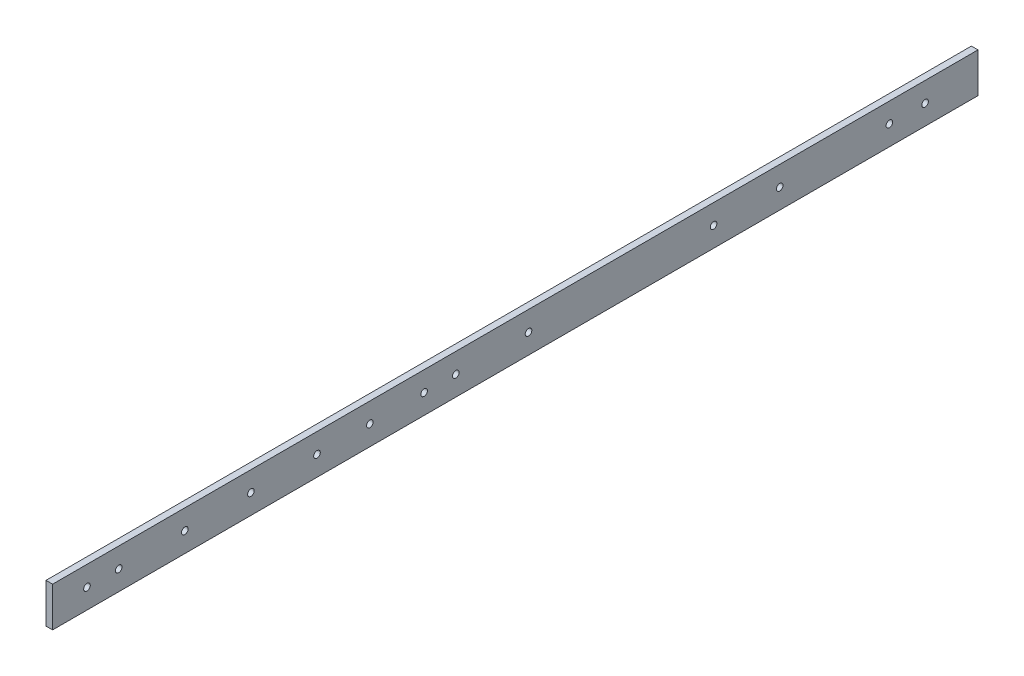
ISO-10303-21;
HEADER;
FILE_DESCRIPTION(('STEP AP214'),'2;1');
FILE_NAME('part.step','',(''),(''),'','','');
FILE_SCHEMA(('AUTOMOTIVE_DESIGN { 1 0 10303 214 1 1 1 1 }'));
ENDSEC;
DATA;
#1=APPLICATION_CONTEXT('core data for automotive mechanical design processes');
#2=APPLICATION_PROTOCOL_DEFINITION('international standard','automotive_design',2000,#1);
#3=PRODUCT_CONTEXT('',#1,'mechanical');
#4=PRODUCT('Part','Part','',(#3));
#5=PRODUCT_RELATED_PRODUCT_CATEGORY('part','',(#4));
#6=PRODUCT_DEFINITION_FORMATION('','',#4);
#7=PRODUCT_DEFINITION_CONTEXT('part definition',#1,'design');
#8=PRODUCT_DEFINITION('design','',#6,#7);
#9=PRODUCT_DEFINITION_SHAPE('','',#8);
#10=(LENGTH_UNIT() NAMED_UNIT(*) SI_UNIT(.MILLI.,.METRE.));
#11=(NAMED_UNIT(*) PLANE_ANGLE_UNIT() SI_UNIT($,.RADIAN.));
#12=(NAMED_UNIT(*) SI_UNIT($,.STERADIAN.) SOLID_ANGLE_UNIT());
#13=UNCERTAINTY_MEASURE_WITH_UNIT(LENGTH_MEASURE(1.E-05),#10,'distance_accuracy_value','');
#14=(GEOMETRIC_REPRESENTATION_CONTEXT(3) GLOBAL_UNCERTAINTY_ASSIGNED_CONTEXT((#13)) GLOBAL_UNIT_ASSIGNED_CONTEXT((#10,
#11,#12)) REPRESENTATION_CONTEXT('',''));
#15=CARTESIAN_POINT('',(0.,0.,0.));
#16=DIRECTION('',(0.,0.,1.));
#17=DIRECTION('',(1.,0.,0.));
#18=AXIS2_PLACEMENT_3D('',#15,#16,#17);
#19=CARTESIAN_POINT('',(0.,0.,700.));
#20=DIRECTION('',(1.,0.,0.));
#21=DIRECTION('',(0.,0.,-1.));
#22=AXIS2_PLACEMENT_3D('',#19,#20,#21);
#23=PLANE('',#22);
#24=CARTESIAN_POINT('',(0.,15.,674.));
#25=DIRECTION('',(1.,0.,0.));
#26=DIRECTION('',(0.,0.,-1.));
#27=AXIS2_PLACEMENT_3D('',#24,#25,#26);
#28=CIRCLE('',#27,2.49999999999991);
#29=CARTESIAN_POINT('',(0.,15.,671.5));
#30=VERTEX_POINT('',#29);
#31=EDGE_CURVE('E106',#30,#30,#28,.T.);
#32=ORIENTED_EDGE('',*,*,#31,.T.);
#33=EDGE_LOOP('',(#32));
#34=FACE_BOUND('',#33,.T.);
#35=CARTESIAN_POINT('',(0.,15.,650.));
#36=DIRECTION('',(1.,0.,0.));
#37=DIRECTION('',(0.,0.,-1.));
#38=AXIS2_PLACEMENT_3D('',#35,#36,#37);
#39=CIRCLE('',#38,2.49999999999991);
#40=CARTESIAN_POINT('',(0.,15.,647.5));
#41=VERTEX_POINT('',#40);
#42=EDGE_CURVE('E183',#41,#41,#39,.T.);
#43=ORIENTED_EDGE('',*,*,#42,.T.);
#44=EDGE_LOOP('',(#43));
#45=FACE_BOUND('',#44,.T.);
#46=CARTESIAN_POINT('',(0.,15.,600.));
#47=DIRECTION('',(1.,0.,0.));
#48=DIRECTION('',(0.,0.,-1.));
#49=AXIS2_PLACEMENT_3D('',#46,#47,#48);
#50=CIRCLE('',#49,2.49999999999991);
#51=CARTESIAN_POINT('',(0.,15.,597.5));
#52=VERTEX_POINT('',#51);
#53=EDGE_CURVE('E177',#52,#52,#50,.T.);
#54=ORIENTED_EDGE('',*,*,#53,.T.);
#55=EDGE_LOOP('',(#54));
#56=FACE_BOUND('',#55,.T.);
#57=CARTESIAN_POINT('',(0.,15.,550.));
#58=DIRECTION('',(1.,0.,0.));
#59=DIRECTION('',(0.,0.,-1.));
#60=AXIS2_PLACEMENT_3D('',#57,#58,#59);
#61=CIRCLE('',#60,2.49999999999991);
#62=CARTESIAN_POINT('',(0.,15.,547.5));
#63=VERTEX_POINT('',#62);
#64=EDGE_CURVE('E171',#63,#63,#61,.T.);
#65=ORIENTED_EDGE('',*,*,#64,.T.);
#66=EDGE_LOOP('',(#65));
#67=FACE_BOUND('',#66,.T.);
#68=CARTESIAN_POINT('',(0.,15.,500.));
#69=DIRECTION('',(1.,0.,0.));
#70=DIRECTION('',(0.,0.,-1.));
#71=AXIS2_PLACEMENT_3D('',#68,#69,#70);
#72=CIRCLE('',#71,2.50000000000002);
#73=CARTESIAN_POINT('',(0.,15.,497.5));
#74=VERTEX_POINT('',#73);
#75=EDGE_CURVE('E165',#74,#74,#72,.T.);
#76=ORIENTED_EDGE('',*,*,#75,.T.);
#77=EDGE_LOOP('',(#76));
#78=FACE_BOUND('',#77,.T.);
#79=CARTESIAN_POINT('',(0.,15.,460.));
#80=DIRECTION('',(1.,0.,0.));
#81=DIRECTION('',(0.,0.,-1.));
#82=AXIS2_PLACEMENT_3D('',#79,#80,#81);
#83=CIRCLE('',#82,2.50000000000002);
#84=CARTESIAN_POINT('',(0.,15.,457.5));
#85=VERTEX_POINT('',#84);
#86=EDGE_CURVE('E159',#85,#85,#83,.T.);
#87=ORIENTED_EDGE('',*,*,#86,.T.);
#88=EDGE_LOOP('',(#87));
#89=FACE_BOUND('',#88,.T.);
#90=CARTESIAN_POINT('',(0.,15.,419.));
#91=DIRECTION('',(1.,0.,0.));
#92=DIRECTION('',(0.,0.,-1.));
#93=AXIS2_PLACEMENT_3D('',#90,#91,#92);
#94=CIRCLE('',#93,2.50000000000002);
#95=CARTESIAN_POINT('',(0.,15.,416.5));
#96=VERTEX_POINT('',#95);
#97=EDGE_CURVE('E153',#96,#96,#94,.T.);
#98=ORIENTED_EDGE('',*,*,#97,.T.);
#99=EDGE_LOOP('',(#98));
#100=FACE_BOUND('',#99,.T.);
#101=CARTESIAN_POINT('',(0.,15.,395.));
#102=DIRECTION('',(1.,0.,0.));
#103=DIRECTION('',(0.,0.,-1.));
#104=AXIS2_PLACEMENT_3D('',#101,#102,#103);
#105=CIRCLE('',#104,2.50000000000002);
#106=CARTESIAN_POINT('',(0.,15.,392.5));
#107=VERTEX_POINT('',#106);
#108=EDGE_CURVE('E147',#107,#107,#105,.T.);
#109=ORIENTED_EDGE('',*,*,#108,.T.);
#110=EDGE_LOOP('',(#109));
#111=FACE_BOUND('',#110,.T.);
#112=CARTESIAN_POINT('',(0.,15.,340.));
#113=DIRECTION('',(1.,0.,0.));
#114=DIRECTION('',(0.,0.,-1.));
#115=AXIS2_PLACEMENT_3D('',#112,#113,#114);
#116=CIRCLE('',#115,2.50000000000002);
#117=CARTESIAN_POINT('',(0.,15.,337.5));
#118=VERTEX_POINT('',#117);
#119=EDGE_CURVE('E130',#118,#118,#116,.T.);
#120=ORIENTED_EDGE('',*,*,#119,.T.);
#121=EDGE_LOOP('',(#120));
#122=FACE_BOUND('',#121,.T.);
#123=CARTESIAN_POINT('',(0.,15.,66.9999999999999));
#124=DIRECTION('',(1.,0.,0.));
#125=DIRECTION('',(0.,0.,-1.));
#126=AXIS2_PLACEMENT_3D('',#123,#124,#125);
#127=CIRCLE('',#126,2.5);
#128=CARTESIAN_POINT('',(0.,15.,64.4999999999999));
#129=VERTEX_POINT('',#128);
#130=EDGE_CURVE('E131',#129,#129,#127,.T.);
#131=ORIENTED_EDGE('',*,*,#130,.T.);
#132=EDGE_LOOP('',(#131));
#133=FACE_BOUND('',#132,.T.);
#134=CARTESIAN_POINT('',(0.,15.,200.));
#135=DIRECTION('',(1.,0.,0.));
#136=DIRECTION('',(0.,0.,-1.));
#137=AXIS2_PLACEMENT_3D('',#134,#135,#136);
#138=CIRCLE('',#137,2.5);
#139=CARTESIAN_POINT('',(0.,15.,197.5));
#140=VERTEX_POINT('',#139);
#141=EDGE_CURVE('E137',#140,#140,#138,.T.);
#142=ORIENTED_EDGE('',*,*,#141,.T.);
#143=EDGE_LOOP('',(#142));
#144=FACE_BOUND('',#143,.T.);
#145=CARTESIAN_POINT('',(0.,15.,150.));
#146=DIRECTION('',(1.,0.,0.));
#147=DIRECTION('',(0.,0.,-1.));
#148=AXIS2_PLACEMENT_3D('',#145,#146,#147);
#149=CIRCLE('',#148,2.5);
#150=CARTESIAN_POINT('',(0.,15.,147.5));
#151=VERTEX_POINT('',#150);
#152=EDGE_CURVE('E117',#151,#151,#149,.T.);
#153=ORIENTED_EDGE('',*,*,#152,.T.);
#154=EDGE_LOOP('',(#153));
#155=FACE_BOUND('',#154,.T.);
#156=CARTESIAN_POINT('',(0.,15.,39.9999999999999));
#157=DIRECTION('',(1.,0.,0.));
#158=DIRECTION('',(0.,0.,-1.));
#159=AXIS2_PLACEMENT_3D('',#156,#157,#158);
#160=CIRCLE('',#159,2.5);
#161=CARTESIAN_POINT('',(0.,15.,37.4999999999999));
#162=VERTEX_POINT('',#161);
#163=EDGE_CURVE('E124',#162,#162,#160,.T.);
#164=ORIENTED_EDGE('',*,*,#163,.T.);
#165=EDGE_LOOP('',(#164));
#166=FACE_BOUND('',#165,.T.);
#167=DIRECTION('',(0.,-1.,0.));
#168=VECTOR('',#167,1.);
#169=CARTESIAN_POINT('',(0.,0.,0.));
#170=LINE('',#169,#168);
#171=CARTESIAN_POINT('',(0.,30.,0.));
#172=VERTEX_POINT('',#171);
#173=CARTESIAN_POINT('',(0.,0.,0.));
#174=VERTEX_POINT('',#173);
#175=EDGE_CURVE('E103',#172,#174,#170,.T.);
#176=ORIENTED_EDGE('',*,*,#175,.T.);
#177=DIRECTION('',(0.,0.,-1.));
#178=VECTOR('',#177,1.);
#179=CARTESIAN_POINT('',(0.,0.,700.));
#180=LINE('',#179,#178);
#181=CARTESIAN_POINT('',(0.,0.,700.));
#182=VERTEX_POINT('',#181);
#183=EDGE_CURVE('E11',#182,#174,#180,.T.);
#184=ORIENTED_EDGE('',*,*,#183,.F.);
#185=DIRECTION('',(0.,-1.,0.));
#186=VECTOR('',#185,1.);
#187=CARTESIAN_POINT('',(0.,0.,700.));
#188=LINE('',#187,#186);
#189=CARTESIAN_POINT('',(0.,30.,700.));
#190=VERTEX_POINT('',#189);
#191=EDGE_CURVE('E91',#190,#182,#188,.T.);
#192=ORIENTED_EDGE('',*,*,#191,.F.);
#193=DIRECTION('',(0.,0.,-1.));
#194=VECTOR('',#193,1.);
#195=CARTESIAN_POINT('',(0.,30.,700.));
#196=LINE('',#195,#194);
#197=EDGE_CURVE('E99',#190,#172,#196,.T.);
#198=ORIENTED_EDGE('',*,*,#197,.T.);
#199=EDGE_LOOP('',(#176,#184,#192,#198));
#200=FACE_BOUND('',#199,.T.);
#201=ADVANCED_FACE('F40',(#34,#45,#56,#67,#78,#89,#100,#111,#122,#133,#144,#155,#166,#200),#23,.F.);
#202=CARTESIAN_POINT('',(0.,0.,700.));
#203=DIRECTION('',(0.,1.,0.));
#204=DIRECTION('',(0.,0.,1.));
#205=AXIS2_PLACEMENT_3D('',#202,#203,#204);
#206=PLANE('',#205);
#207=DIRECTION('',(1.,0.,0.));
#208=VECTOR('',#207,1.);
#209=CARTESIAN_POINT('',(0.,0.,0.));
#210=LINE('',#209,#208);
#211=CARTESIAN_POINT('',(5.,0.,0.));
#212=VERTEX_POINT('',#211);
#213=EDGE_CURVE('E95',#174,#212,#210,.T.);
#214=ORIENTED_EDGE('',*,*,#213,.T.);
#215=DIRECTION('',(0.,0.,-1.));
#216=VECTOR('',#215,1.);
#217=CARTESIAN_POINT('',(5.,0.,700.));
#218=LINE('',#217,#216);
#219=CARTESIAN_POINT('',(5.,0.,700.));
#220=VERTEX_POINT('',#219);
#221=EDGE_CURVE('E48',#220,#212,#218,.T.);
#222=ORIENTED_EDGE('',*,*,#221,.F.);
#223=DIRECTION('',(1.,0.,0.));
#224=VECTOR('',#223,1.);
#225=CARTESIAN_POINT('',(0.,0.,700.));
#226=LINE('',#225,#224);
#227=EDGE_CURVE('E86',#182,#220,#226,.T.);
#228=ORIENTED_EDGE('',*,*,#227,.F.);
#229=ORIENTED_EDGE('',*,*,#183,.T.);
#230=EDGE_LOOP('',(#214,#222,#228,#229));
#231=FACE_BOUND('',#230,.T.);
#232=ADVANCED_FACE('F94',(#231),#206,.F.);
#233=CARTESIAN_POINT('',(5.,0.,700.));
#234=DIRECTION('',(-1.,0.,0.));
#235=DIRECTION('',(0.,0.,1.));
#236=AXIS2_PLACEMENT_3D('',#233,#234,#235);
#237=PLANE('',#236);
#238=CARTESIAN_POINT('',(5.,15.,674.));
#239=DIRECTION('',(1.,0.,0.));
#240=DIRECTION('',(0.,0.,-1.));
#241=AXIS2_PLACEMENT_3D('',#238,#239,#240);
#242=CIRCLE('',#241,2.49999999999991);
#243=CARTESIAN_POINT('',(5.,15.,671.5));
#244=VERTEX_POINT('',#243);
#245=EDGE_CURVE('E189',#244,#244,#242,.T.);
#246=ORIENTED_EDGE('',*,*,#245,.F.);
#247=EDGE_LOOP('',(#246));
#248=FACE_BOUND('',#247,.T.);
#249=CARTESIAN_POINT('',(5.,15.,650.));
#250=DIRECTION('',(1.,0.,0.));
#251=DIRECTION('',(0.,0.,-1.));
#252=AXIS2_PLACEMENT_3D('',#249,#250,#251);
#253=CIRCLE('',#252,2.49999999999991);
#254=CARTESIAN_POINT('',(5.,15.,647.5));
#255=VERTEX_POINT('',#254);
#256=EDGE_CURVE('E186',#255,#255,#253,.T.);
#257=ORIENTED_EDGE('',*,*,#256,.F.);
#258=EDGE_LOOP('',(#257));
#259=FACE_BOUND('',#258,.T.);
#260=CARTESIAN_POINT('',(5.,15.,600.));
#261=DIRECTION('',(1.,0.,0.));
#262=DIRECTION('',(0.,0.,-1.));
#263=AXIS2_PLACEMENT_3D('',#260,#261,#262);
#264=CIRCLE('',#263,2.49999999999991);
#265=CARTESIAN_POINT('',(5.,15.,597.5));
#266=VERTEX_POINT('',#265);
#267=EDGE_CURVE('E180',#266,#266,#264,.T.);
#268=ORIENTED_EDGE('',*,*,#267,.F.);
#269=EDGE_LOOP('',(#268));
#270=FACE_BOUND('',#269,.T.);
#271=CARTESIAN_POINT('',(5.,15.,550.));
#272=DIRECTION('',(1.,0.,0.));
#273=DIRECTION('',(0.,0.,-1.));
#274=AXIS2_PLACEMENT_3D('',#271,#272,#273);
#275=CIRCLE('',#274,2.49999999999991);
#276=CARTESIAN_POINT('',(5.,15.,547.5));
#277=VERTEX_POINT('',#276);
#278=EDGE_CURVE('E174',#277,#277,#275,.T.);
#279=ORIENTED_EDGE('',*,*,#278,.F.);
#280=EDGE_LOOP('',(#279));
#281=FACE_BOUND('',#280,.T.);
#282=CARTESIAN_POINT('',(5.,15.,500.));
#283=DIRECTION('',(1.,0.,0.));
#284=DIRECTION('',(0.,0.,-1.));
#285=AXIS2_PLACEMENT_3D('',#282,#283,#284);
#286=CIRCLE('',#285,2.50000000000002);
#287=CARTESIAN_POINT('',(5.,15.,497.5));
#288=VERTEX_POINT('',#287);
#289=EDGE_CURVE('E168',#288,#288,#286,.T.);
#290=ORIENTED_EDGE('',*,*,#289,.F.);
#291=EDGE_LOOP('',(#290));
#292=FACE_BOUND('',#291,.T.);
#293=CARTESIAN_POINT('',(5.,15.,460.));
#294=DIRECTION('',(1.,0.,0.));
#295=DIRECTION('',(0.,0.,-1.));
#296=AXIS2_PLACEMENT_3D('',#293,#294,#295);
#297=CIRCLE('',#296,2.50000000000002);
#298=CARTESIAN_POINT('',(5.,15.,457.5));
#299=VERTEX_POINT('',#298);
#300=EDGE_CURVE('E162',#299,#299,#297,.T.);
#301=ORIENTED_EDGE('',*,*,#300,.F.);
#302=EDGE_LOOP('',(#301));
#303=FACE_BOUND('',#302,.T.);
#304=CARTESIAN_POINT('',(5.,15.,419.));
#305=DIRECTION('',(1.,0.,0.));
#306=DIRECTION('',(0.,0.,-1.));
#307=AXIS2_PLACEMENT_3D('',#304,#305,#306);
#308=CIRCLE('',#307,2.50000000000002);
#309=CARTESIAN_POINT('',(5.,15.,416.5));
#310=VERTEX_POINT('',#309);
#311=EDGE_CURVE('E156',#310,#310,#308,.T.);
#312=ORIENTED_EDGE('',*,*,#311,.F.);
#313=EDGE_LOOP('',(#312));
#314=FACE_BOUND('',#313,.T.);
#315=CARTESIAN_POINT('',(5.,15.,395.));
#316=DIRECTION('',(1.,0.,0.));
#317=DIRECTION('',(0.,0.,-1.));
#318=AXIS2_PLACEMENT_3D('',#315,#316,#317);
#319=CIRCLE('',#318,2.50000000000002);
#320=CARTESIAN_POINT('',(5.,15.,392.5));
#321=VERTEX_POINT('',#320);
#322=EDGE_CURVE('E150',#321,#321,#319,.T.);
#323=ORIENTED_EDGE('',*,*,#322,.F.);
#324=EDGE_LOOP('',(#323));
#325=FACE_BOUND('',#324,.T.);
#326=CARTESIAN_POINT('',(5.,15.,340.));
#327=DIRECTION('',(1.,0.,0.));
#328=DIRECTION('',(0.,0.,-1.));
#329=AXIS2_PLACEMENT_3D('',#326,#327,#328);
#330=CIRCLE('',#329,2.50000000000002);
#331=CARTESIAN_POINT('',(5.,15.,337.5));
#332=VERTEX_POINT('',#331);
#333=EDGE_CURVE('E144',#332,#332,#330,.T.);
#334=ORIENTED_EDGE('',*,*,#333,.F.);
#335=EDGE_LOOP('',(#334));
#336=FACE_BOUND('',#335,.T.);
#337=CARTESIAN_POINT('',(5.,15.,66.9999999999999));
#338=DIRECTION('',(1.,0.,0.));
#339=DIRECTION('',(0.,0.,-1.));
#340=AXIS2_PLACEMENT_3D('',#337,#338,#339);
#341=CIRCLE('',#340,2.5);
#342=CARTESIAN_POINT('',(5.,15.,64.4999999999999));
#343=VERTEX_POINT('',#342);
#344=EDGE_CURVE('E134',#343,#343,#341,.T.);
#345=ORIENTED_EDGE('',*,*,#344,.F.);
#346=EDGE_LOOP('',(#345));
#347=FACE_BOUND('',#346,.T.);
#348=CARTESIAN_POINT('',(5.,15.,200.));
#349=DIRECTION('',(1.,0.,0.));
#350=DIRECTION('',(0.,0.,-1.));
#351=AXIS2_PLACEMENT_3D('',#348,#349,#350);
#352=CIRCLE('',#351,2.5);
#353=CARTESIAN_POINT('',(5.,15.,197.5));
#354=VERTEX_POINT('',#353);
#355=EDGE_CURVE('E121',#354,#354,#352,.T.);
#356=ORIENTED_EDGE('',*,*,#355,.F.);
#357=EDGE_LOOP('',(#356));
#358=FACE_BOUND('',#357,.T.);
#359=CARTESIAN_POINT('',(5.,15.,150.));
#360=DIRECTION('',(1.,0.,0.));
#361=DIRECTION('',(0.,0.,-1.));
#362=AXIS2_PLACEMENT_3D('',#359,#360,#361);
#363=CIRCLE('',#362,2.5);
#364=CARTESIAN_POINT('',(5.,15.,147.5));
#365=VERTEX_POINT('',#364);
#366=EDGE_CURVE('E120',#365,#365,#363,.T.);
#367=ORIENTED_EDGE('',*,*,#366,.F.);
#368=EDGE_LOOP('',(#367));
#369=FACE_BOUND('',#368,.T.);
#370=CARTESIAN_POINT('',(5.,15.,39.9999999999999));
#371=DIRECTION('',(1.,0.,0.));
#372=DIRECTION('',(0.,0.,-1.));
#373=AXIS2_PLACEMENT_3D('',#370,#371,#372);
#374=CIRCLE('',#373,2.5);
#375=CARTESIAN_POINT('',(5.,15.,37.4999999999999));
#376=VERTEX_POINT('',#375);
#377=EDGE_CURVE('E127',#376,#376,#374,.T.);
#378=ORIENTED_EDGE('',*,*,#377,.F.);
#379=EDGE_LOOP('',(#378));
#380=FACE_BOUND('',#379,.T.);
#381=DIRECTION('',(0.,1.,0.));
#382=VECTOR('',#381,1.);
#383=CARTESIAN_POINT('',(5.,0.,0.));
#384=LINE('',#383,#382);
#385=CARTESIAN_POINT('',(5.,30.,0.));
#386=VERTEX_POINT('',#385);
#387=EDGE_CURVE('E73',#212,#386,#384,.T.);
#388=ORIENTED_EDGE('',*,*,#387,.T.);
#389=DIRECTION('',(0.,0.,-1.));
#390=VECTOR('',#389,1.);
#391=CARTESIAN_POINT('',(5.,30.,700.));
#392=LINE('',#391,#390);
#393=CARTESIAN_POINT('',(5.,30.,700.));
#394=VERTEX_POINT('',#393);
#395=EDGE_CURVE('E96',#394,#386,#392,.T.);
#396=ORIENTED_EDGE('',*,*,#395,.F.);
#397=DIRECTION('',(0.,1.,0.));
#398=VECTOR('',#397,1.);
#399=CARTESIAN_POINT('',(5.,0.,700.));
#400=LINE('',#399,#398);
#401=EDGE_CURVE('E89',#220,#394,#400,.T.);
#402=ORIENTED_EDGE('',*,*,#401,.F.);
#403=ORIENTED_EDGE('',*,*,#221,.T.);
#404=EDGE_LOOP('',(#388,#396,#402,#403));
#405=FACE_BOUND('',#404,.T.);
#406=ADVANCED_FACE('F97',(#248,#259,#270,#281,#292,#303,#314,#325,#336,#347,#358,#369,#380,
#405),#237,.F.);
#407=CARTESIAN_POINT('',(0.,30.,700.));
#408=DIRECTION('',(0.,-1.,0.));
#409=DIRECTION('',(0.,0.,-1.));
#410=AXIS2_PLACEMENT_3D('',#407,#408,#409);
#411=PLANE('',#410);
#412=DIRECTION('',(-1.,0.,0.));
#413=VECTOR('',#412,1.);
#414=CARTESIAN_POINT('',(0.,30.,0.));
#415=LINE('',#414,#413);
#416=EDGE_CURVE('E79',#386,#172,#415,.T.);
#417=ORIENTED_EDGE('',*,*,#416,.T.);
#418=ORIENTED_EDGE('',*,*,#197,.F.);
#419=DIRECTION('',(-1.,0.,0.));
#420=VECTOR('',#419,1.);
#421=CARTESIAN_POINT('',(0.,30.,700.));
#422=LINE('',#421,#420);
#423=EDGE_CURVE('E56',#394,#190,#422,.T.);
#424=ORIENTED_EDGE('',*,*,#423,.F.);
#425=ORIENTED_EDGE('',*,*,#395,.T.);
#426=EDGE_LOOP('',(#417,#418,#424,#425));
#427=FACE_BOUND('',#426,.T.);
#428=ADVANCED_FACE('F111',(#427),#411,.F.);
#429=CARTESIAN_POINT('',(0.,0.,700.));
#430=DIRECTION('',(0.,0.,-1.));
#431=DIRECTION('',(-1.,0.,0.));
#432=AXIS2_PLACEMENT_3D('',#429,#430,#431);
#433=PLANE('',#432);
#434=ORIENTED_EDGE('',*,*,#191,.T.);
#435=ORIENTED_EDGE('',*,*,#227,.T.);
#436=ORIENTED_EDGE('',*,*,#401,.T.);
#437=ORIENTED_EDGE('',*,*,#423,.T.);
#438=EDGE_LOOP('',(#434,#435,#436,#437));
#439=FACE_BOUND('',#438,.T.);
#440=ADVANCED_FACE('F87',(#439),#433,.F.);
#441=CARTESIAN_POINT('',(0.,0.,0.));
#442=DIRECTION('',(0.,0.,-1.));
#443=DIRECTION('',(-1.,0.,0.));
#444=AXIS2_PLACEMENT_3D('',#441,#442,#443);
#445=PLANE('',#444);
#446=ORIENTED_EDGE('',*,*,#175,.F.);
#447=ORIENTED_EDGE('',*,*,#416,.F.);
#448=ORIENTED_EDGE('',*,*,#387,.F.);
#449=ORIENTED_EDGE('',*,*,#213,.F.);
#450=EDGE_LOOP('',(#446,#447,#448,#449));
#451=FACE_BOUND('',#450,.T.);
#452=ADVANCED_FACE('F114',(#451),#445,.T.);
#453=CARTESIAN_POINT('',(0.,15.,39.9999999999999));
#454=DIRECTION('',(1.,0.,0.));
#455=DIRECTION('',(0.,0.,-1.));
#456=AXIS2_PLACEMENT_3D('',#453,#454,#455);
#457=CYLINDRICAL_SURFACE('',#456,2.5);
#458=ORIENTED_EDGE('',*,*,#163,.F.);
#459=EDGE_LOOP('',(#458));
#460=FACE_BOUND('',#459,.T.);
#461=ORIENTED_EDGE('',*,*,#377,.T.);
#462=EDGE_LOOP('',(#461));
#463=FACE_BOUND('',#462,.T.);
#464=ADVANCED_FACE('F231',(#460,#463),#457,.F.);
#465=CARTESIAN_POINT('',(0.,15.,150.));
#466=DIRECTION('',(1.,0.,0.));
#467=DIRECTION('',(0.,0.,-1.));
#468=AXIS2_PLACEMENT_3D('',#465,#466,#467);
#469=CYLINDRICAL_SURFACE('',#468,2.5);
#470=ORIENTED_EDGE('',*,*,#152,.F.);
#471=EDGE_LOOP('',(#470));
#472=FACE_BOUND('',#471,.T.);
#473=ORIENTED_EDGE('',*,*,#366,.T.);
#474=EDGE_LOOP('',(#473));
#475=FACE_BOUND('',#474,.T.);
#476=ADVANCED_FACE('F233',(#472,#475),#469,.F.);
#477=CARTESIAN_POINT('',(0.,15.,200.));
#478=DIRECTION('',(1.,0.,0.));
#479=DIRECTION('',(0.,0.,-1.));
#480=AXIS2_PLACEMENT_3D('',#477,#478,#479);
#481=CYLINDRICAL_SURFACE('',#480,2.5);
#482=ORIENTED_EDGE('',*,*,#141,.F.);
#483=EDGE_LOOP('',(#482));
#484=FACE_BOUND('',#483,.T.);
#485=ORIENTED_EDGE('',*,*,#355,.T.);
#486=EDGE_LOOP('',(#485));
#487=FACE_BOUND('',#486,.T.);
#488=ADVANCED_FACE('F240',(#484,#487),#481,.F.);
#489=CARTESIAN_POINT('',(0.,15.,66.9999999999999));
#490=DIRECTION('',(1.,0.,0.));
#491=DIRECTION('',(0.,0.,-1.));
#492=AXIS2_PLACEMENT_3D('',#489,#490,#491);
#493=CYLINDRICAL_SURFACE('',#492,2.5);
#494=ORIENTED_EDGE('',*,*,#130,.F.);
#495=EDGE_LOOP('',(#494));
#496=FACE_BOUND('',#495,.T.);
#497=ORIENTED_EDGE('',*,*,#344,.T.);
#498=EDGE_LOOP('',(#497));
#499=FACE_BOUND('',#498,.T.);
#500=ADVANCED_FACE('F295',(#496,#499),#493,.F.);
#501=CARTESIAN_POINT('',(0.,15.,340.));
#502=DIRECTION('',(1.,0.,0.));
#503=DIRECTION('',(0.,0.,-1.));
#504=AXIS2_PLACEMENT_3D('',#501,#502,#503);
#505=CYLINDRICAL_SURFACE('',#504,2.50000000000002);
#506=ORIENTED_EDGE('',*,*,#119,.F.);
#507=EDGE_LOOP('',(#506));
#508=FACE_BOUND('',#507,.T.);
#509=ORIENTED_EDGE('',*,*,#333,.T.);
#510=EDGE_LOOP('',(#509));
#511=FACE_BOUND('',#510,.T.);
#512=ADVANCED_FACE('F305',(#508,#511),#505,.F.);
#513=CARTESIAN_POINT('',(0.,15.,395.));
#514=DIRECTION('',(1.,0.,0.));
#515=DIRECTION('',(0.,0.,-1.));
#516=AXIS2_PLACEMENT_3D('',#513,#514,#515);
#517=CYLINDRICAL_SURFACE('',#516,2.50000000000002);
#518=ORIENTED_EDGE('',*,*,#108,.F.);
#519=EDGE_LOOP('',(#518));
#520=FACE_BOUND('',#519,.T.);
#521=ORIENTED_EDGE('',*,*,#322,.T.);
#522=EDGE_LOOP('',(#521));
#523=FACE_BOUND('',#522,.T.);
#524=ADVANCED_FACE('F314',(#520,#523),#517,.F.);
#525=CARTESIAN_POINT('',(0.,15.,419.));
#526=DIRECTION('',(1.,0.,0.));
#527=DIRECTION('',(0.,0.,-1.));
#528=AXIS2_PLACEMENT_3D('',#525,#526,#527);
#529=CYLINDRICAL_SURFACE('',#528,2.50000000000002);
#530=ORIENTED_EDGE('',*,*,#97,.F.);
#531=EDGE_LOOP('',(#530));
#532=FACE_BOUND('',#531,.T.);
#533=ORIENTED_EDGE('',*,*,#311,.T.);
#534=EDGE_LOOP('',(#533));
#535=FACE_BOUND('',#534,.T.);
#536=ADVANCED_FACE('F324',(#532,#535),#529,.F.);
#537=CARTESIAN_POINT('',(0.,15.,460.));
#538=DIRECTION('',(1.,0.,0.));
#539=DIRECTION('',(0.,0.,-1.));
#540=AXIS2_PLACEMENT_3D('',#537,#538,#539);
#541=CYLINDRICAL_SURFACE('',#540,2.50000000000002);
#542=ORIENTED_EDGE('',*,*,#86,.F.);
#543=EDGE_LOOP('',(#542));
#544=FACE_BOUND('',#543,.T.);
#545=ORIENTED_EDGE('',*,*,#300,.T.);
#546=EDGE_LOOP('',(#545));
#547=FACE_BOUND('',#546,.T.);
#548=ADVANCED_FACE('F334',(#544,#547),#541,.F.);
#549=CARTESIAN_POINT('',(0.,15.,500.));
#550=DIRECTION('',(1.,0.,0.));
#551=DIRECTION('',(0.,0.,-1.));
#552=AXIS2_PLACEMENT_3D('',#549,#550,#551);
#553=CYLINDRICAL_SURFACE('',#552,2.50000000000002);
#554=ORIENTED_EDGE('',*,*,#75,.F.);
#555=EDGE_LOOP('',(#554));
#556=FACE_BOUND('',#555,.T.);
#557=ORIENTED_EDGE('',*,*,#289,.T.);
#558=EDGE_LOOP('',(#557));
#559=FACE_BOUND('',#558,.T.);
#560=ADVANCED_FACE('F344',(#556,#559),#553,.F.);
#561=CARTESIAN_POINT('',(0.,15.,550.));
#562=DIRECTION('',(1.,0.,0.));
#563=DIRECTION('',(0.,0.,-1.));
#564=AXIS2_PLACEMENT_3D('',#561,#562,#563);
#565=CYLINDRICAL_SURFACE('',#564,2.49999999999991);
#566=ORIENTED_EDGE('',*,*,#64,.F.);
#567=EDGE_LOOP('',(#566));
#568=FACE_BOUND('',#567,.T.);
#569=ORIENTED_EDGE('',*,*,#278,.T.);
#570=EDGE_LOOP('',(#569));
#571=FACE_BOUND('',#570,.T.);
#572=ADVANCED_FACE('F354',(#568,#571),#565,.F.);
#573=CARTESIAN_POINT('',(0.,15.,600.));
#574=DIRECTION('',(1.,0.,0.));
#575=DIRECTION('',(0.,0.,-1.));
#576=AXIS2_PLACEMENT_3D('',#573,#574,#575);
#577=CYLINDRICAL_SURFACE('',#576,2.49999999999991);
#578=ORIENTED_EDGE('',*,*,#53,.F.);
#579=EDGE_LOOP('',(#578));
#580=FACE_BOUND('',#579,.T.);
#581=ORIENTED_EDGE('',*,*,#267,.T.);
#582=EDGE_LOOP('',(#581));
#583=FACE_BOUND('',#582,.T.);
#584=ADVANCED_FACE('F364',(#580,#583),#577,.F.);
#585=CARTESIAN_POINT('',(0.,15.,650.));
#586=DIRECTION('',(1.,0.,0.));
#587=DIRECTION('',(0.,0.,-1.));
#588=AXIS2_PLACEMENT_3D('',#585,#586,#587);
#589=CYLINDRICAL_SURFACE('',#588,2.49999999999991);
#590=ORIENTED_EDGE('',*,*,#42,.F.);
#591=EDGE_LOOP('',(#590));
#592=FACE_BOUND('',#591,.T.);
#593=ORIENTED_EDGE('',*,*,#256,.T.);
#594=EDGE_LOOP('',(#593));
#595=FACE_BOUND('',#594,.T.);
#596=ADVANCED_FACE('F200',(#592,#595),#589,.F.);
#597=CARTESIAN_POINT('',(0.,15.,674.));
#598=DIRECTION('',(1.,0.,0.));
#599=DIRECTION('',(0.,0.,-1.));
#600=AXIS2_PLACEMENT_3D('',#597,#598,#599);
#601=CYLINDRICAL_SURFACE('',#600,2.49999999999991);
#602=ORIENTED_EDGE('',*,*,#31,.F.);
#603=EDGE_LOOP('',(#602));
#604=FACE_BOUND('',#603,.T.);
#605=ORIENTED_EDGE('',*,*,#245,.T.);
#606=EDGE_LOOP('',(#605));
#607=FACE_BOUND('',#606,.T.);
#608=ADVANCED_FACE('F197',(#604,#607),#601,.F.);
#609=CLOSED_SHELL('',(#201,#232,#406,#428,#440,#452,#464,#476,#488,#500,#512,#524,#536,#548,
#560,#572,#584,#596,#608));
#610=MANIFOLD_SOLID_BREP('B2',#609);
#611=ADVANCED_BREP_SHAPE_REPRESENTATION('',(#18,#610),#14);
#612=SHAPE_DEFINITION_REPRESENTATION(#9,#611);
ENDSEC;
END-ISO-10303-21;
